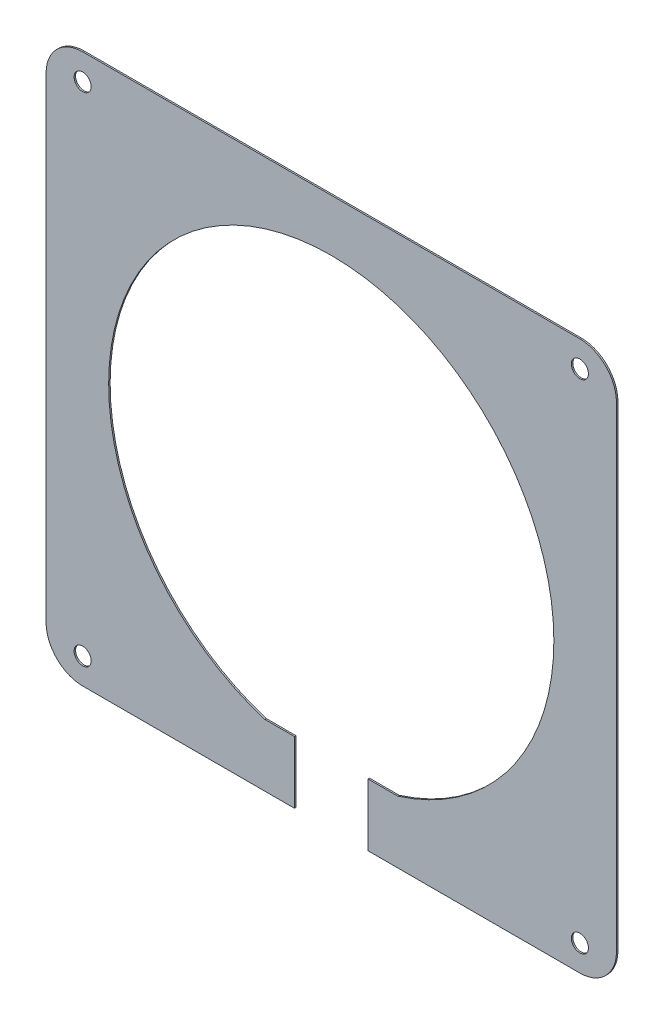
ISO-10303-21;
HEADER;
FILE_DESCRIPTION(('STEP AP214'),'2;1');
FILE_NAME('part.step','',(''),(''),'','','');
FILE_SCHEMA(('AUTOMOTIVE_DESIGN { 1 0 10303 214 1 1 1 1 }'));
ENDSEC;
DATA;
#1=APPLICATION_CONTEXT('core data for automotive mechanical design processes');
#2=APPLICATION_PROTOCOL_DEFINITION('international standard','automotive_design',2000,#1);
#3=PRODUCT_CONTEXT('',#1,'mechanical');
#4=PRODUCT('Part','Part','',(#3));
#5=PRODUCT_RELATED_PRODUCT_CATEGORY('part','',(#4));
#6=PRODUCT_DEFINITION_FORMATION('','',#4);
#7=PRODUCT_DEFINITION_CONTEXT('part definition',#1,'design');
#8=PRODUCT_DEFINITION('design','',#6,#7);
#9=PRODUCT_DEFINITION_SHAPE('','',#8);
#10=(LENGTH_UNIT() NAMED_UNIT(*) SI_UNIT(.MILLI.,.METRE.));
#11=(NAMED_UNIT(*) PLANE_ANGLE_UNIT() SI_UNIT($,.RADIAN.));
#12=(NAMED_UNIT(*) SI_UNIT($,.STERADIAN.) SOLID_ANGLE_UNIT());
#13=UNCERTAINTY_MEASURE_WITH_UNIT(LENGTH_MEASURE(1.E-05),#10,'distance_accuracy_value','');
#14=(GEOMETRIC_REPRESENTATION_CONTEXT(3) GLOBAL_UNCERTAINTY_ASSIGNED_CONTEXT((#13)) GLOBAL_UNIT_ASSIGNED_CONTEXT((#10,
#11,#12)) REPRESENTATION_CONTEXT('',''));
#15=CARTESIAN_POINT('',(0.,0.,0.));
#16=DIRECTION('',(0.,0.,1.));
#17=DIRECTION('',(1.,0.,0.));
#18=AXIS2_PLACEMENT_3D('',#15,#16,#17);
#19=CARTESIAN_POINT('',(0.,0.,0.254));
#20=DIRECTION('',(0.,0.,-1.));
#21=DIRECTION('',(-1.,0.,0.));
#22=AXIS2_PLACEMENT_3D('',#19,#20,#21);
#23=CYLINDRICAL_SURFACE('',#22,38.5);
#24=CARTESIAN_POINT('',(0.,0.,0.));
#25=DIRECTION('',(0.,0.,1.));
#26=DIRECTION('',(1.,0.,0.));
#27=AXIS2_PLACEMENT_3D('',#24,#25,#26);
#28=CIRCLE('',#27,38.5);
#29=CARTESIAN_POINT('',(11.5,-36.7423461417477,0.));
#30=VERTEX_POINT('',#29);
#31=CARTESIAN_POINT('',(-11.5,-36.7423461417477,0.));
#32=VERTEX_POINT('',#31);
#33=EDGE_CURVE('E153',#30,#32,#28,.T.);
#34=ORIENTED_EDGE('',*,*,#33,.F.);
#35=DIRECTION('',(0.,0.,-1.));
#36=VECTOR('',#35,1.);
#37=CARTESIAN_POINT('',(11.5,-36.7423461417477,0.254));
#38=LINE('',#37,#36);
#39=CARTESIAN_POINT('',(11.5,-36.7423461417477,0.254));
#40=VERTEX_POINT('',#39);
#41=EDGE_CURVE('E148',#40,#30,#38,.T.);
#42=ORIENTED_EDGE('',*,*,#41,.F.);
#43=CARTESIAN_POINT('',(0.,0.,0.254));
#44=DIRECTION('',(0.,0.,1.));
#45=DIRECTION('',(1.,0.,0.));
#46=AXIS2_PLACEMENT_3D('',#43,#44,#45);
#47=CIRCLE('',#46,38.5);
#48=CARTESIAN_POINT('',(-11.5,-36.7423461417477,0.254));
#49=VERTEX_POINT('',#48);
#50=EDGE_CURVE('E150',#40,#49,#47,.T.);
#51=ORIENTED_EDGE('',*,*,#50,.T.);
#52=DIRECTION('',(0.,0.,-1.));
#53=VECTOR('',#52,1.);
#54=CARTESIAN_POINT('',(-11.5,-36.7423461417477,0.254));
#55=LINE('',#54,#53);
#56=EDGE_CURVE('E203',#49,#32,#55,.T.);
#57=ORIENTED_EDGE('',*,*,#56,.T.);
#58=EDGE_LOOP('',(#34,#42,#51,#57));
#59=FACE_BOUND('',#58,.T.);
#60=ADVANCED_FACE('F45',(#59),#23,.F.);
#61=CARTESIAN_POINT('',(0.,-36.7423461417477,0.254));
#62=DIRECTION('',(0.,1.,0.));
#63=DIRECTION('',(0.,0.,1.));
#64=AXIS2_PLACEMENT_3D('',#61,#62,#63);
#65=PLANE('',#64);
#66=DIRECTION('',(1.,0.,0.));
#67=VECTOR('',#66,1.);
#68=CARTESIAN_POINT('',(0.,-36.7423461417477,0.));
#69=LINE('',#68,#67);
#70=CARTESIAN_POINT('',(6.35000000000001,-36.7423461417477,0.));
#71=VERTEX_POINT('',#70);
#72=EDGE_CURVE('E222',#71,#30,#69,.T.);
#73=ORIENTED_EDGE('',*,*,#72,.F.);
#74=DIRECTION('',(0.,0.,-1.));
#75=VECTOR('',#74,1.);
#76=CARTESIAN_POINT('',(6.35000000000001,-36.7423461417477,0.254));
#77=LINE('',#76,#75);
#78=CARTESIAN_POINT('',(6.35000000000001,-36.7423461417477,0.254));
#79=VERTEX_POINT('',#78);
#80=EDGE_CURVE('E160',#79,#71,#77,.T.);
#81=ORIENTED_EDGE('',*,*,#80,.F.);
#82=DIRECTION('',(1.,0.,0.));
#83=VECTOR('',#82,1.);
#84=CARTESIAN_POINT('',(0.,-36.7423461417477,0.254));
#85=LINE('',#84,#83);
#86=EDGE_CURVE('E166',#79,#40,#85,.T.);
#87=ORIENTED_EDGE('',*,*,#86,.T.);
#88=ORIENTED_EDGE('',*,*,#41,.T.);
#89=EDGE_LOOP('',(#73,#81,#87,#88));
#90=FACE_BOUND('',#89,.T.);
#91=ADVANCED_FACE('F173',(#90),#65,.T.);
#92=CARTESIAN_POINT('',(6.35000000000001,0.,0.254));
#93=DIRECTION('',(1.,0.,0.));
#94=DIRECTION('',(0.,0.,-1.));
#95=AXIS2_PLACEMENT_3D('',#92,#93,#94);
#96=PLANE('',#95);
#97=DIRECTION('',(0.,-1.,0.));
#98=VECTOR('',#97,1.);
#99=CARTESIAN_POINT('',(6.35000000000001,0.,0.));
#100=LINE('',#99,#98);
#101=CARTESIAN_POINT('',(6.35000000000001,-47.5,0.));
#102=VERTEX_POINT('',#101);
#103=EDGE_CURVE('E225',#71,#102,#100,.T.);
#104=ORIENTED_EDGE('',*,*,#103,.T.);
#105=DIRECTION('',(0.,0.,-1.));
#106=VECTOR('',#105,1.);
#107=CARTESIAN_POINT('',(6.35000000000001,-47.5,0.254));
#108=LINE('',#107,#106);
#109=CARTESIAN_POINT('',(6.35000000000001,-47.5,0.254));
#110=VERTEX_POINT('',#109);
#111=EDGE_CURVE('E264',#110,#102,#108,.T.);
#112=ORIENTED_EDGE('',*,*,#111,.F.);
#113=DIRECTION('',(0.,-1.,0.));
#114=VECTOR('',#113,1.);
#115=CARTESIAN_POINT('',(6.35000000000001,0.,0.254));
#116=LINE('',#115,#114);
#117=EDGE_CURVE('E176',#79,#110,#116,.T.);
#118=ORIENTED_EDGE('',*,*,#117,.F.);
#119=ORIENTED_EDGE('',*,*,#80,.T.);
#120=EDGE_LOOP('',(#104,#112,#118,#119));
#121=FACE_BOUND('',#120,.T.);
#122=ADVANCED_FACE('F332',(#121),#96,.F.);
#123=CARTESIAN_POINT('',(0.,-47.5,0.254));
#124=DIRECTION('',(0.,1.,0.));
#125=DIRECTION('',(0.,0.,1.));
#126=AXIS2_PLACEMENT_3D('',#123,#124,#125);
#127=PLANE('',#126);
#128=DIRECTION('',(1.,0.,0.));
#129=VECTOR('',#128,1.);
#130=CARTESIAN_POINT('',(0.,-47.5,0.));
#131=LINE('',#130,#129);
#132=CARTESIAN_POINT('',(42.975,-47.5,0.));
#133=VERTEX_POINT('',#132);
#134=EDGE_CURVE('E229',#102,#133,#131,.T.);
#135=ORIENTED_EDGE('',*,*,#134,.T.);
#136=DIRECTION('',(0.,0.,-1.));
#137=VECTOR('',#136,1.);
#138=CARTESIAN_POINT('',(42.975,-47.5,0.254));
#139=LINE('',#138,#137);
#140=CARTESIAN_POINT('',(42.975,-47.5,0.254));
#141=VERTEX_POINT('',#140);
#142=EDGE_CURVE('E310',#133,#141,#139,.F.);
#143=ORIENTED_EDGE('',*,*,#142,.T.);
#144=DIRECTION('',(1.,0.,0.));
#145=VECTOR('',#144,1.);
#146=CARTESIAN_POINT('',(0.,-47.5,0.254));
#147=LINE('',#146,#145);
#148=EDGE_CURVE('E179',#110,#141,#147,.T.);
#149=ORIENTED_EDGE('',*,*,#148,.F.);
#150=ORIENTED_EDGE('',*,*,#111,.T.);
#151=EDGE_LOOP('',(#135,#143,#149,#150));
#152=FACE_BOUND('',#151,.T.);
#153=ADVANCED_FACE('F431',(#152),#127,.F.);
#154=CARTESIAN_POINT('',(49.325,0.,0.254));
#155=DIRECTION('',(1.,0.,0.));
#156=DIRECTION('',(0.,1.,0.));
#157=AXIS2_PLACEMENT_3D('',#154,#155,#156);
#158=PLANE('',#157);
#159=DIRECTION('',(0.,-1.,0.));
#160=VECTOR('',#159,1.);
#161=CARTESIAN_POINT('',(49.325,0.,0.254));
#162=LINE('',#161,#160);
#163=CARTESIAN_POINT('',(49.325,41.15,0.254));
#164=VERTEX_POINT('',#163);
#165=CARTESIAN_POINT('',(49.325,-41.15,0.254));
#166=VERTEX_POINT('',#165);
#167=EDGE_CURVE('E186',#164,#166,#162,.T.);
#168=ORIENTED_EDGE('',*,*,#167,.T.);
#169=DIRECTION('',(0.,0.,-1.));
#170=VECTOR('',#169,1.);
#171=CARTESIAN_POINT('',(49.325,-41.15,0.));
#172=LINE('',#171,#170);
#173=CARTESIAN_POINT('',(49.325,-41.15,0.));
#174=VERTEX_POINT('',#173);
#175=EDGE_CURVE('E306',#166,#174,#172,.T.);
#176=ORIENTED_EDGE('',*,*,#175,.T.);
#177=DIRECTION('',(0.,-1.,0.));
#178=VECTOR('',#177,1.);
#179=CARTESIAN_POINT('',(49.325,0.,0.));
#180=LINE('',#179,#178);
#181=CARTESIAN_POINT('',(49.325,41.15,0.));
#182=VERTEX_POINT('',#181);
#183=EDGE_CURVE('E233',#182,#174,#180,.T.);
#184=ORIENTED_EDGE('',*,*,#183,.F.);
#185=DIRECTION('',(0.,0.,-1.));
#186=VECTOR('',#185,1.);
#187=CARTESIAN_POINT('',(49.325,41.15,0.254));
#188=LINE('',#187,#186);
#189=EDGE_CURVE('E303',#182,#164,#188,.F.);
#190=ORIENTED_EDGE('',*,*,#189,.T.);
#191=EDGE_LOOP('',(#168,#176,#184,#190));
#192=FACE_BOUND('',#191,.T.);
#193=ADVANCED_FACE('F341',(#192),#158,.T.);
#194=CARTESIAN_POINT('',(0.,47.5,0.254));
#195=DIRECTION('',(0.,1.,0.));
#196=DIRECTION('',(0.,0.,1.));
#197=AXIS2_PLACEMENT_3D('',#194,#195,#196);
#198=PLANE('',#197);
#199=DIRECTION('',(1.,0.,0.));
#200=VECTOR('',#199,1.);
#201=CARTESIAN_POINT('',(0.,47.5,0.254));
#202=LINE('',#201,#200);
#203=CARTESIAN_POINT('',(-42.975,47.5,0.254));
#204=VERTEX_POINT('',#203);
#205=CARTESIAN_POINT('',(42.975,47.5,0.254));
#206=VERTEX_POINT('',#205);
#207=EDGE_CURVE('E191',#204,#206,#202,.T.);
#208=ORIENTED_EDGE('',*,*,#207,.T.);
#209=DIRECTION('',(0.,0.,-1.));
#210=VECTOR('',#209,1.);
#211=CARTESIAN_POINT('',(42.975,47.5,0.254));
#212=LINE('',#211,#210);
#213=CARTESIAN_POINT('',(42.975,47.5,0.));
#214=VERTEX_POINT('',#213);
#215=EDGE_CURVE('E11',#206,#214,#212,.T.);
#216=ORIENTED_EDGE('',*,*,#215,.T.);
#217=DIRECTION('',(1.,0.,0.));
#218=VECTOR('',#217,1.);
#219=CARTESIAN_POINT('',(0.,47.5,0.));
#220=LINE('',#219,#218);
#221=CARTESIAN_POINT('',(-42.975,47.5,0.));
#222=VERTEX_POINT('',#221);
#223=EDGE_CURVE('E238',#222,#214,#220,.T.);
#224=ORIENTED_EDGE('',*,*,#223,.F.);
#225=DIRECTION('',(0.,0.,-1.));
#226=VECTOR('',#225,1.);
#227=CARTESIAN_POINT('',(-42.975,47.5,0.254));
#228=LINE('',#227,#226);
#229=EDGE_CURVE('E54',#222,#204,#228,.F.);
#230=ORIENTED_EDGE('',*,*,#229,.T.);
#231=EDGE_LOOP('',(#208,#216,#224,#230));
#232=FACE_BOUND('',#231,.T.);
#233=ADVANCED_FACE('F346',(#232),#198,.T.);
#234=CARTESIAN_POINT('',(-49.325,0.,0.254));
#235=DIRECTION('',(1.,0.,0.));
#236=DIRECTION('',(0.,1.,0.));
#237=AXIS2_PLACEMENT_3D('',#234,#235,#236);
#238=PLANE('',#237);
#239=DIRECTION('',(0.,-1.,0.));
#240=VECTOR('',#239,1.);
#241=CARTESIAN_POINT('',(-49.325,0.,0.));
#242=LINE('',#241,#240);
#243=CARTESIAN_POINT('',(-49.325,41.15,0.));
#244=VERTEX_POINT('',#243);
#245=CARTESIAN_POINT('',(-49.325,-41.15,0.));
#246=VERTEX_POINT('',#245);
#247=EDGE_CURVE('E242',#244,#246,#242,.T.);
#248=ORIENTED_EDGE('',*,*,#247,.T.);
#249=DIRECTION('',(0.,0.,-1.));
#250=VECTOR('',#249,1.);
#251=CARTESIAN_POINT('',(-49.325,-41.15,0.254));
#252=LINE('',#251,#250);
#253=CARTESIAN_POINT('',(-49.325,-41.15,0.254));
#254=VERTEX_POINT('',#253);
#255=EDGE_CURVE('E289',#246,#254,#252,.F.);
#256=ORIENTED_EDGE('',*,*,#255,.T.);
#257=DIRECTION('',(0.,-1.,0.));
#258=VECTOR('',#257,1.);
#259=CARTESIAN_POINT('',(-49.325,0.,0.254));
#260=LINE('',#259,#258);
#261=CARTESIAN_POINT('',(-49.325,41.15,0.254));
#262=VERTEX_POINT('',#261);
#263=EDGE_CURVE('E194',#262,#254,#260,.T.);
#264=ORIENTED_EDGE('',*,*,#263,.F.);
#265=DIRECTION('',(0.,0.,-1.));
#266=VECTOR('',#265,1.);
#267=CARTESIAN_POINT('',(-49.325,41.15,0.));
#268=LINE('',#267,#266);
#269=EDGE_CURVE('E285',#262,#244,#268,.T.);
#270=ORIENTED_EDGE('',*,*,#269,.T.);
#271=EDGE_LOOP('',(#248,#256,#264,#270));
#272=FACE_BOUND('',#271,.T.);
#273=ADVANCED_FACE('F353',(#272),#238,.F.);
#274=CARTESIAN_POINT('',(-42.975,-47.5,0.254));
#275=VERTEX_POINT('',#274);
#276=CARTESIAN_POINT('',(-6.34999999999999,-47.5,0.254));
#277=VERTEX_POINT('',#276);
#278=EDGE_CURVE('E187',#275,#277,#147,.T.);
#279=ORIENTED_EDGE('',*,*,#278,.F.);
#280=DIRECTION('',(0.,0.,-1.));
#281=VECTOR('',#280,1.);
#282=CARTESIAN_POINT('',(-42.975,-47.5,0.254));
#283=LINE('',#282,#281);
#284=CARTESIAN_POINT('',(-42.975,-47.5,0.));
#285=VERTEX_POINT('',#284);
#286=EDGE_CURVE('E159',#275,#285,#283,.T.);
#287=ORIENTED_EDGE('',*,*,#286,.T.);
#288=CARTESIAN_POINT('',(-6.34999999999999,-47.5,0.));
#289=VERTEX_POINT('',#288);
#290=EDGE_CURVE('E234',#285,#289,#131,.T.);
#291=ORIENTED_EDGE('',*,*,#290,.T.);
#292=DIRECTION('',(0.,0.,-1.));
#293=VECTOR('',#292,1.);
#294=CARTESIAN_POINT('',(-6.34999999999999,-47.5,0.254));
#295=LINE('',#294,#293);
#296=EDGE_CURVE('E260',#277,#289,#295,.T.);
#297=ORIENTED_EDGE('',*,*,#296,.F.);
#298=EDGE_LOOP('',(#279,#287,#291,#297));
#299=FACE_BOUND('',#298,.T.);
#300=ADVANCED_FACE('F319',(#299),#127,.F.);
#301=CARTESIAN_POINT('',(-6.34999999999999,0.,0.254));
#302=DIRECTION('',(1.,0.,0.));
#303=DIRECTION('',(0.,1.,0.));
#304=AXIS2_PLACEMENT_3D('',#301,#302,#303);
#305=PLANE('',#304);
#306=DIRECTION('',(0.,-1.,0.));
#307=VECTOR('',#306,1.);
#308=CARTESIAN_POINT('',(-6.34999999999999,0.,0.));
#309=LINE('',#308,#307);
#310=CARTESIAN_POINT('',(-6.34999999999999,-36.7423461417477,0.));
#311=VERTEX_POINT('',#310);
#312=EDGE_CURVE('E246',#311,#289,#309,.T.);
#313=ORIENTED_EDGE('',*,*,#312,.F.);
#314=DIRECTION('',(0.,0.,-1.));
#315=VECTOR('',#314,1.);
#316=CARTESIAN_POINT('',(-6.34999999999999,-36.7423461417477,0.254));
#317=LINE('',#316,#315);
#318=CARTESIAN_POINT('',(-6.34999999999999,-36.7423461417477,0.254));
#319=VERTEX_POINT('',#318);
#320=EDGE_CURVE('E257',#319,#311,#317,.T.);
#321=ORIENTED_EDGE('',*,*,#320,.F.);
#322=DIRECTION('',(0.,-1.,0.));
#323=VECTOR('',#322,1.);
#324=CARTESIAN_POINT('',(-6.34999999999999,0.,0.254));
#325=LINE('',#324,#323);
#326=EDGE_CURVE('E197',#319,#277,#325,.T.);
#327=ORIENTED_EDGE('',*,*,#326,.T.);
#328=ORIENTED_EDGE('',*,*,#296,.T.);
#329=EDGE_LOOP('',(#313,#321,#327,#328));
#330=FACE_BOUND('',#329,.T.);
#331=ADVANCED_FACE('F323',(#330),#305,.T.);
#332=CARTESIAN_POINT('',(-43.,43.,0.254));
#333=DIRECTION('',(0.,0.,-1.));
#334=DIRECTION('',(-1.,0.,0.));
#335=AXIS2_PLACEMENT_3D('',#332,#333,#334);
#336=CYLINDRICAL_SURFACE('',#335,1.475);
#337=CARTESIAN_POINT('',(-43.,43.,0.254));
#338=DIRECTION('',(0.,0.,1.));
#339=DIRECTION('',(1.,0.,0.));
#340=AXIS2_PLACEMENT_3D('',#337,#338,#339);
#341=CIRCLE('',#340,1.475);
#342=CARTESIAN_POINT('',(-41.525,43.,0.254));
#343=VERTEX_POINT('',#342);
#344=EDGE_CURVE('E171',#343,#343,#341,.T.);
#345=ORIENTED_EDGE('',*,*,#344,.T.);
#346=EDGE_LOOP('',(#345));
#347=FACE_BOUND('',#346,.T.);
#348=CARTESIAN_POINT('',(-43.,43.,0.));
#349=DIRECTION('',(0.,0.,1.));
#350=DIRECTION('',(1.,0.,0.));
#351=AXIS2_PLACEMENT_3D('',#348,#349,#350);
#352=CIRCLE('',#351,1.475);
#353=CARTESIAN_POINT('',(-41.525,43.,0.));
#354=VERTEX_POINT('',#353);
#355=EDGE_CURVE('E216',#354,#354,#352,.T.);
#356=ORIENTED_EDGE('',*,*,#355,.F.);
#357=EDGE_LOOP('',(#356));
#358=FACE_BOUND('',#357,.T.);
#359=ADVANCED_FACE('F375',(#347,#358),#336,.F.);
#360=CARTESIAN_POINT('',(43.,43.,0.254));
#361=DIRECTION('',(0.,0.,-1.));
#362=DIRECTION('',(-1.,0.,0.));
#363=AXIS2_PLACEMENT_3D('',#360,#361,#362);
#364=CYLINDRICAL_SURFACE('',#363,1.475);
#365=CARTESIAN_POINT('',(43.,43.,0.254));
#366=DIRECTION('',(0.,0.,1.));
#367=DIRECTION('',(1.,0.,0.));
#368=AXIS2_PLACEMENT_3D('',#365,#366,#367);
#369=CIRCLE('',#368,1.475);
#370=CARTESIAN_POINT('',(44.475,43.,0.254));
#371=VERTEX_POINT('',#370);
#372=EDGE_CURVE('E412',#371,#371,#369,.T.);
#373=ORIENTED_EDGE('',*,*,#372,.T.);
#374=EDGE_LOOP('',(#373));
#375=FACE_BOUND('',#374,.T.);
#376=CARTESIAN_POINT('',(43.,43.,0.));
#377=DIRECTION('',(0.,0.,1.));
#378=DIRECTION('',(1.,0.,0.));
#379=AXIS2_PLACEMENT_3D('',#376,#377,#378);
#380=CIRCLE('',#379,1.475);
#381=CARTESIAN_POINT('',(44.475,43.,0.));
#382=VERTEX_POINT('',#381);
#383=EDGE_CURVE('E212',#382,#382,#380,.T.);
#384=ORIENTED_EDGE('',*,*,#383,.F.);
#385=EDGE_LOOP('',(#384));
#386=FACE_BOUND('',#385,.T.);
#387=ADVANCED_FACE('F378',(#375,#386),#364,.F.);
#388=CARTESIAN_POINT('',(43.,-43.,0.254));
#389=DIRECTION('',(0.,0.,-1.));
#390=DIRECTION('',(-1.,0.,0.));
#391=AXIS2_PLACEMENT_3D('',#388,#389,#390);
#392=CYLINDRICAL_SURFACE('',#391,1.475);
#393=CARTESIAN_POINT('',(43.,-43.,0.254));
#394=DIRECTION('',(0.,0.,1.));
#395=DIRECTION('',(1.,0.,0.));
#396=AXIS2_PLACEMENT_3D('',#393,#394,#395);
#397=CIRCLE('',#396,1.475);
#398=CARTESIAN_POINT('',(44.475,-43.,0.254));
#399=VERTEX_POINT('',#398);
#400=EDGE_CURVE('E408',#399,#399,#397,.T.);
#401=ORIENTED_EDGE('',*,*,#400,.T.);
#402=EDGE_LOOP('',(#401));
#403=FACE_BOUND('',#402,.T.);
#404=CARTESIAN_POINT('',(43.,-43.,0.));
#405=DIRECTION('',(0.,0.,1.));
#406=DIRECTION('',(1.,0.,0.));
#407=AXIS2_PLACEMENT_3D('',#404,#405,#406);
#408=CIRCLE('',#407,1.475);
#409=CARTESIAN_POINT('',(44.475,-43.,0.));
#410=VERTEX_POINT('',#409);
#411=EDGE_CURVE('E208',#410,#410,#408,.T.);
#412=ORIENTED_EDGE('',*,*,#411,.F.);
#413=EDGE_LOOP('',(#412));
#414=FACE_BOUND('',#413,.T.);
#415=ADVANCED_FACE('F382',(#403,#414),#392,.F.);
#416=CARTESIAN_POINT('',(-43.,-43.,0.254));
#417=DIRECTION('',(0.,0.,-1.));
#418=DIRECTION('',(-1.,0.,0.));
#419=AXIS2_PLACEMENT_3D('',#416,#417,#418);
#420=CYLINDRICAL_SURFACE('',#419,1.475);
#421=CARTESIAN_POINT('',(-43.,-43.,0.254));
#422=DIRECTION('',(0.,0.,1.));
#423=DIRECTION('',(1.,0.,0.));
#424=AXIS2_PLACEMENT_3D('',#421,#422,#423);
#425=CIRCLE('',#424,1.475);
#426=CARTESIAN_POINT('',(-41.525,-43.,0.254));
#427=VERTEX_POINT('',#426);
#428=EDGE_CURVE('E254',#427,#427,#425,.T.);
#429=ORIENTED_EDGE('',*,*,#428,.T.);
#430=EDGE_LOOP('',(#429));
#431=FACE_BOUND('',#430,.T.);
#432=CARTESIAN_POINT('',(-43.,-43.,0.));
#433=DIRECTION('',(0.,0.,1.));
#434=DIRECTION('',(1.,0.,0.));
#435=AXIS2_PLACEMENT_3D('',#432,#433,#434);
#436=CIRCLE('',#435,1.475);
#437=CARTESIAN_POINT('',(-41.525,-43.,0.));
#438=VERTEX_POINT('',#437);
#439=EDGE_CURVE('E204',#438,#438,#436,.T.);
#440=ORIENTED_EDGE('',*,*,#439,.F.);
#441=EDGE_LOOP('',(#440));
#442=FACE_BOUND('',#441,.T.);
#443=ADVANCED_FACE('F385',(#431,#442),#420,.F.);
#444=CARTESIAN_POINT('',(0.,-36.7423461417477,0.254));
#445=DIRECTION('',(0.,1.,0.));
#446=DIRECTION('',(0.,0.,1.));
#447=AXIS2_PLACEMENT_3D('',#444,#445,#446);
#448=PLANE('',#447);
#449=DIRECTION('',(1.,0.,0.));
#450=VECTOR('',#449,1.);
#451=CARTESIAN_POINT('',(0.,-36.7423461417477,0.));
#452=LINE('',#451,#450);
#453=EDGE_CURVE('E250',#32,#311,#452,.T.);
#454=ORIENTED_EDGE('',*,*,#453,.F.);
#455=ORIENTED_EDGE('',*,*,#56,.F.);
#456=DIRECTION('',(1.,0.,0.));
#457=VECTOR('',#456,1.);
#458=CARTESIAN_POINT('',(0.,-36.7423461417477,0.254));
#459=LINE('',#458,#457);
#460=EDGE_CURVE('E169',#49,#319,#459,.T.);
#461=ORIENTED_EDGE('',*,*,#460,.T.);
#462=ORIENTED_EDGE('',*,*,#320,.T.);
#463=EDGE_LOOP('',(#454,#455,#461,#462));
#464=FACE_BOUND('',#463,.T.);
#465=ADVANCED_FACE('F326',(#464),#448,.T.);
#466=CARTESIAN_POINT('',(0.,0.,0.254));
#467=DIRECTION('',(0.,0.,1.));
#468=DIRECTION('',(1.,0.,0.));
#469=AXIS2_PLACEMENT_3D('',#466,#467,#468);
#470=PLANE('',#469);
#471=ORIENTED_EDGE('',*,*,#428,.F.);
#472=EDGE_LOOP('',(#471));
#473=FACE_BOUND('',#472,.T.);
#474=ORIENTED_EDGE('',*,*,#400,.F.);
#475=EDGE_LOOP('',(#474));
#476=FACE_BOUND('',#475,.T.);
#477=ORIENTED_EDGE('',*,*,#372,.F.);
#478=EDGE_LOOP('',(#477));
#479=FACE_BOUND('',#478,.T.);
#480=ORIENTED_EDGE('',*,*,#344,.F.);
#481=EDGE_LOOP('',(#480));
#482=FACE_BOUND('',#481,.T.);
#483=ORIENTED_EDGE('',*,*,#263,.T.);
#484=CARTESIAN_POINT('',(-42.975,-41.15,0.254));
#485=DIRECTION('',(0.,0.,1.));
#486=DIRECTION('',(1.,0.,0.));
#487=AXIS2_PLACEMENT_3D('',#484,#485,#486);
#488=CIRCLE('',#487,6.35);
#489=EDGE_CURVE('E300',#254,#275,#488,.T.);
#490=ORIENTED_EDGE('',*,*,#489,.T.);
#491=ORIENTED_EDGE('',*,*,#278,.T.);
#492=ORIENTED_EDGE('',*,*,#326,.F.);
#493=ORIENTED_EDGE('',*,*,#460,.F.);
#494=ORIENTED_EDGE('',*,*,#50,.F.);
#495=ORIENTED_EDGE('',*,*,#86,.F.);
#496=ORIENTED_EDGE('',*,*,#117,.T.);
#497=ORIENTED_EDGE('',*,*,#148,.T.);
#498=CARTESIAN_POINT('',(42.975,-41.15,0.254));
#499=DIRECTION('',(0.,0.,1.));
#500=DIRECTION('',(1.,0.,0.));
#501=AXIS2_PLACEMENT_3D('',#498,#499,#500);
#502=CIRCLE('',#501,6.35);
#503=EDGE_CURVE('E297',#141,#166,#502,.T.);
#504=ORIENTED_EDGE('',*,*,#503,.T.);
#505=ORIENTED_EDGE('',*,*,#167,.F.);
#506=CARTESIAN_POINT('',(42.975,41.15,0.254));
#507=DIRECTION('',(0.,0.,1.));
#508=DIRECTION('',(1.,0.,0.));
#509=AXIS2_PLACEMENT_3D('',#506,#507,#508);
#510=CIRCLE('',#509,6.35);
#511=EDGE_CURVE('E61',#164,#206,#510,.T.);
#512=ORIENTED_EDGE('',*,*,#511,.T.);
#513=ORIENTED_EDGE('',*,*,#207,.F.);
#514=CARTESIAN_POINT('',(-42.975,41.15,0.254));
#515=DIRECTION('',(0.,0.,1.));
#516=DIRECTION('',(1.,0.,0.));
#517=AXIS2_PLACEMENT_3D('',#514,#515,#516);
#518=CIRCLE('',#517,6.35);
#519=EDGE_CURVE('E292',#204,#262,#518,.T.);
#520=ORIENTED_EDGE('',*,*,#519,.T.);
#521=EDGE_LOOP('',(#483,#490,#491,#492,#493,#494,#495,#496,#497,#504,#505,#512,#513,#520));
#522=FACE_BOUND('',#521,.T.);
#523=ADVANCED_FACE('F164',(#473,#476,#479,#482,#522),#470,.T.);
#524=CARTESIAN_POINT('',(0.,0.,0.));
#525=DIRECTION('',(0.,0.,1.));
#526=DIRECTION('',(1.,0.,0.));
#527=AXIS2_PLACEMENT_3D('',#524,#525,#526);
#528=PLANE('',#527);
#529=ORIENTED_EDGE('',*,*,#439,.T.);
#530=EDGE_LOOP('',(#529));
#531=FACE_BOUND('',#530,.T.);
#532=ORIENTED_EDGE('',*,*,#411,.T.);
#533=EDGE_LOOP('',(#532));
#534=FACE_BOUND('',#533,.T.);
#535=ORIENTED_EDGE('',*,*,#383,.T.);
#536=EDGE_LOOP('',(#535));
#537=FACE_BOUND('',#536,.T.);
#538=ORIENTED_EDGE('',*,*,#355,.T.);
#539=EDGE_LOOP('',(#538));
#540=FACE_BOUND('',#539,.T.);
#541=ORIENTED_EDGE('',*,*,#290,.F.);
#542=CARTESIAN_POINT('',(-42.975,-41.15,0.));
#543=DIRECTION('',(0.,0.,1.));
#544=DIRECTION('',(1.,0.,0.));
#545=AXIS2_PLACEMENT_3D('',#542,#543,#544);
#546=CIRCLE('',#545,6.35);
#547=EDGE_CURVE('E282',#285,#246,#546,.F.);
#548=ORIENTED_EDGE('',*,*,#547,.T.);
#549=ORIENTED_EDGE('',*,*,#247,.F.);
#550=CARTESIAN_POINT('',(-42.975,41.15,0.));
#551=DIRECTION('',(0.,0.,1.));
#552=DIRECTION('',(1.,0.,0.));
#553=AXIS2_PLACEMENT_3D('',#550,#551,#552);
#554=CIRCLE('',#553,6.35);
#555=EDGE_CURVE('E273',#244,#222,#554,.F.);
#556=ORIENTED_EDGE('',*,*,#555,.T.);
#557=ORIENTED_EDGE('',*,*,#223,.T.);
#558=CARTESIAN_POINT('',(42.975,41.15,0.));
#559=DIRECTION('',(0.,0.,1.));
#560=DIRECTION('',(1.,0.,0.));
#561=AXIS2_PLACEMENT_3D('',#558,#559,#560);
#562=CIRCLE('',#561,6.35);
#563=EDGE_CURVE('E276',#214,#182,#562,.F.);
#564=ORIENTED_EDGE('',*,*,#563,.T.);
#565=ORIENTED_EDGE('',*,*,#183,.T.);
#566=CARTESIAN_POINT('',(42.975,-41.15,0.));
#567=DIRECTION('',(0.,0.,1.));
#568=DIRECTION('',(1.,0.,0.));
#569=AXIS2_PLACEMENT_3D('',#566,#567,#568);
#570=CIRCLE('',#569,6.35);
#571=EDGE_CURVE('E279',#174,#133,#570,.F.);
#572=ORIENTED_EDGE('',*,*,#571,.T.);
#573=ORIENTED_EDGE('',*,*,#134,.F.);
#574=ORIENTED_EDGE('',*,*,#103,.F.);
#575=ORIENTED_EDGE('',*,*,#72,.T.);
#576=ORIENTED_EDGE('',*,*,#33,.T.);
#577=ORIENTED_EDGE('',*,*,#453,.T.);
#578=ORIENTED_EDGE('',*,*,#312,.T.);
#579=EDGE_LOOP('',(#541,#548,#549,#556,#557,#564,#565,#572,#573,#574,#575,#576,#577,#578));
#580=FACE_BOUND('',#579,.T.);
#581=ADVANCED_FACE('F328',(#531,#534,#537,#540,#580),#528,.F.);
#582=CARTESIAN_POINT('',(-42.975,-41.15,0.254));
#583=DIRECTION('',(0.,0.,-1.));
#584=DIRECTION('',(-1.,0.,0.));
#585=AXIS2_PLACEMENT_3D('',#582,#583,#584);
#586=CYLINDRICAL_SURFACE('',#585,6.35);
#587=ORIENTED_EDGE('',*,*,#489,.F.);
#588=ORIENTED_EDGE('',*,*,#255,.F.);
#589=ORIENTED_EDGE('',*,*,#547,.F.);
#590=ORIENTED_EDGE('',*,*,#286,.F.);
#591=EDGE_LOOP('',(#587,#588,#589,#590));
#592=FACE_BOUND('',#591,.T.);
#593=ADVANCED_FACE('F356',(#592),#586,.T.);
#594=CARTESIAN_POINT('',(42.975,-41.15,0.254));
#595=DIRECTION('',(0.,0.,1.));
#596=DIRECTION('',(1.,0.,0.));
#597=AXIS2_PLACEMENT_3D('',#594,#595,#596);
#598=CYLINDRICAL_SURFACE('',#597,6.35);
#599=ORIENTED_EDGE('',*,*,#503,.F.);
#600=ORIENTED_EDGE('',*,*,#142,.F.);
#601=ORIENTED_EDGE('',*,*,#571,.F.);
#602=ORIENTED_EDGE('',*,*,#175,.F.);
#603=EDGE_LOOP('',(#599,#600,#601,#602));
#604=FACE_BOUND('',#603,.T.);
#605=ADVANCED_FACE('F338',(#604),#598,.T.);
#606=CARTESIAN_POINT('',(42.975,41.15,0.254));
#607=DIRECTION('',(0.,0.,-1.));
#608=DIRECTION('',(-1.,0.,0.));
#609=AXIS2_PLACEMENT_3D('',#606,#607,#608);
#610=CYLINDRICAL_SURFACE('',#609,6.35);
#611=ORIENTED_EDGE('',*,*,#511,.F.);
#612=ORIENTED_EDGE('',*,*,#189,.F.);
#613=ORIENTED_EDGE('',*,*,#563,.F.);
#614=ORIENTED_EDGE('',*,*,#215,.F.);
#615=EDGE_LOOP('',(#611,#612,#613,#614));
#616=FACE_BOUND('',#615,.T.);
#617=ADVANCED_FACE('F345',(#616),#610,.T.);
#618=CARTESIAN_POINT('',(-42.975,41.15,0.254));
#619=DIRECTION('',(0.,0.,1.));
#620=DIRECTION('',(1.,0.,0.));
#621=AXIS2_PLACEMENT_3D('',#618,#619,#620);
#622=CYLINDRICAL_SURFACE('',#621,6.35);
#623=ORIENTED_EDGE('',*,*,#519,.F.);
#624=ORIENTED_EDGE('',*,*,#229,.F.);
#625=ORIENTED_EDGE('',*,*,#555,.F.);
#626=ORIENTED_EDGE('',*,*,#269,.F.);
#627=EDGE_LOOP('',(#623,#624,#625,#626));
#628=FACE_BOUND('',#627,.T.);
#629=ADVANCED_FACE('F47',(#628),#622,.T.);
#630=CLOSED_SHELL('',(#60,#91,#122,#153,#193,#233,#273,#300,#331,#359,#387,#415,#443,#465,#523,
#581,#593,#605,#617,#629));
#631=MANIFOLD_SOLID_BREP('B2',#630);
#632=ADVANCED_BREP_SHAPE_REPRESENTATION('',(#18,#631),#14);
#633=SHAPE_DEFINITION_REPRESENTATION(#9,#632);
ENDSEC;
END-ISO-10303-21;
